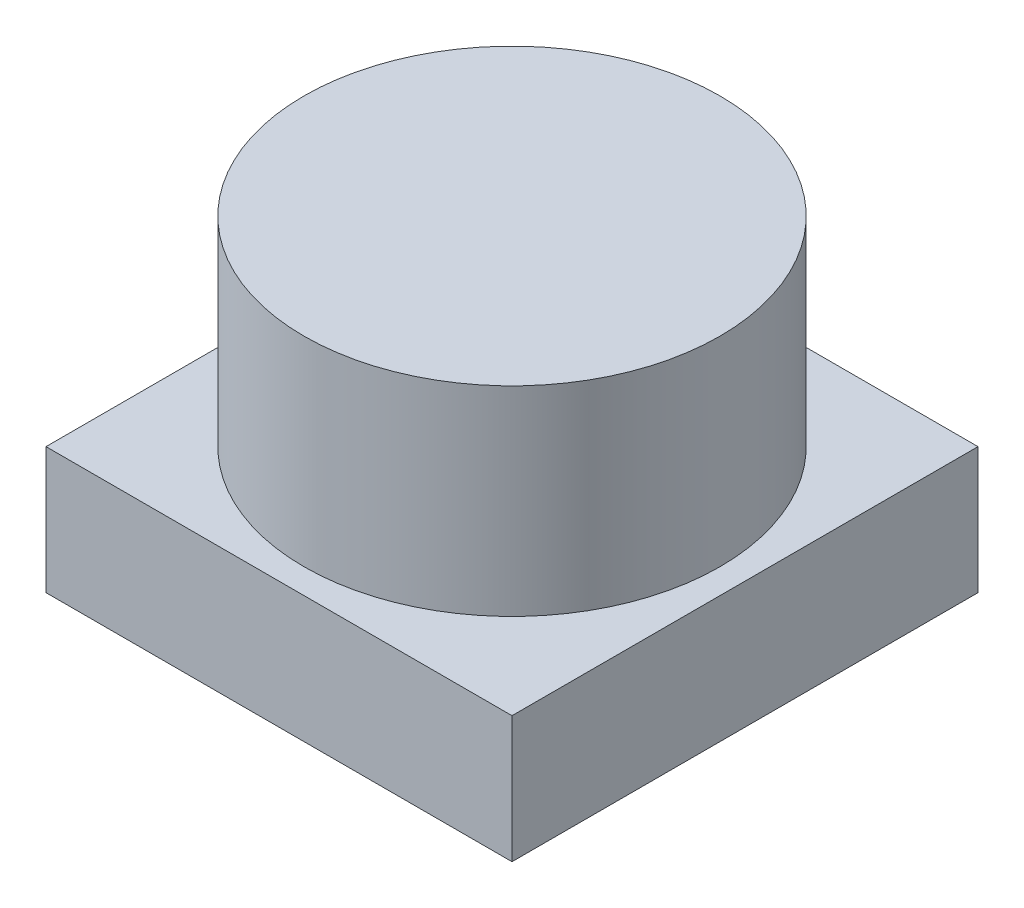
ISO-10303-21;
HEADER;
FILE_DESCRIPTION(('STEP AP214'),'2;1');
FILE_NAME('part.step','',(''),(''),'','','');
FILE_SCHEMA(('AUTOMOTIVE_DESIGN { 1 0 10303 214 1 1 1 1 }'));
ENDSEC;
DATA;
#1=APPLICATION_CONTEXT('core data for automotive mechanical design processes');
#2=APPLICATION_PROTOCOL_DEFINITION('international standard','automotive_design',2000,#1);
#3=PRODUCT_CONTEXT('',#1,'mechanical');
#4=PRODUCT('Part','Part','',(#3));
#5=PRODUCT_RELATED_PRODUCT_CATEGORY('part','',(#4));
#6=PRODUCT_DEFINITION_FORMATION('','',#4);
#7=PRODUCT_DEFINITION_CONTEXT('part definition',#1,'design');
#8=PRODUCT_DEFINITION('design','',#6,#7);
#9=PRODUCT_DEFINITION_SHAPE('','',#8);
#10=(LENGTH_UNIT() NAMED_UNIT(*) SI_UNIT(.MILLI.,.METRE.));
#11=(NAMED_UNIT(*) PLANE_ANGLE_UNIT() SI_UNIT($,.RADIAN.));
#12=(NAMED_UNIT(*) SI_UNIT($,.STERADIAN.) SOLID_ANGLE_UNIT());
#13=UNCERTAINTY_MEASURE_WITH_UNIT(LENGTH_MEASURE(1.E-05),#10,'distance_accuracy_value','');
#14=(GEOMETRIC_REPRESENTATION_CONTEXT(3) GLOBAL_UNCERTAINTY_ASSIGNED_CONTEXT((#13)) GLOBAL_UNIT_ASSIGNED_CONTEXT((#10,
#11,#12)) REPRESENTATION_CONTEXT('',''));
#15=CARTESIAN_POINT('',(0.,0.,0.));
#16=DIRECTION('',(0.,0.,1.));
#17=DIRECTION('',(1.,0.,0.));
#18=AXIS2_PLACEMENT_3D('',#15,#16,#17);
#19=CARTESIAN_POINT('',(-3.5,1.9,-3.5));
#20=DIRECTION('',(1.,0.,0.));
#21=DIRECTION('',(0.,0.,-1.));
#22=AXIS2_PLACEMENT_3D('',#19,#20,#21);
#23=PLANE('',#22);
#24=DIRECTION('',(0.,0.,1.));
#25=VECTOR('',#24,1.);
#26=CARTESIAN_POINT('',(-3.5,0.,-3.5));
#27=LINE('',#26,#25);
#28=CARTESIAN_POINT('',(-3.5,0.,-3.5));
#29=VERTEX_POINT('',#28);
#30=CARTESIAN_POINT('',(-3.5,0.,3.5));
#31=VERTEX_POINT('',#30);
#32=EDGE_CURVE('E110',#29,#31,#27,.T.);
#33=ORIENTED_EDGE('',*,*,#32,.T.);
#34=DIRECTION('',(0.,-1.,0.));
#35=VECTOR('',#34,1.);
#36=CARTESIAN_POINT('',(-3.5,1.9,3.5));
#37=LINE('',#36,#35);
#38=CARTESIAN_POINT('',(-3.5,1.9,3.5));
#39=VERTEX_POINT('',#38);
#40=EDGE_CURVE('E47',#39,#31,#37,.T.);
#41=ORIENTED_EDGE('',*,*,#40,.F.);
#42=DIRECTION('',(0.,0.,1.));
#43=VECTOR('',#42,1.);
#44=CARTESIAN_POINT('',(-3.5,1.9,-3.5));
#45=LINE('',#44,#43);
#46=CARTESIAN_POINT('',(-3.5,1.9,-3.5));
#47=VERTEX_POINT('',#46);
#48=EDGE_CURVE('E97',#47,#39,#45,.T.);
#49=ORIENTED_EDGE('',*,*,#48,.F.);
#50=DIRECTION('',(0.,-1.,0.));
#51=VECTOR('',#50,1.);
#52=CARTESIAN_POINT('',(-3.5,1.9,-3.5));
#53=LINE('',#52,#51);
#54=EDGE_CURVE('E106',#47,#29,#53,.T.);
#55=ORIENTED_EDGE('',*,*,#54,.T.);
#56=EDGE_LOOP('',(#33,#41,#49,#55));
#57=FACE_BOUND('',#56,.T.);
#58=ADVANCED_FACE('F44',(#57),#23,.F.);
#59=CARTESIAN_POINT('',(3.5,1.9,3.5));
#60=DIRECTION('',(0.,0.,-1.));
#61=DIRECTION('',(-1.,0.,0.));
#62=AXIS2_PLACEMENT_3D('',#59,#60,#61);
#63=PLANE('',#62);
#64=DIRECTION('',(1.,0.,0.));
#65=VECTOR('',#64,1.);
#66=CARTESIAN_POINT('',(3.5,0.,3.5));
#67=LINE('',#66,#65);
#68=CARTESIAN_POINT('',(3.5,0.,3.5));
#69=VERTEX_POINT('',#68);
#70=EDGE_CURVE('E102',#31,#69,#67,.T.);
#71=ORIENTED_EDGE('',*,*,#70,.T.);
#72=DIRECTION('',(0.,-1.,0.));
#73=VECTOR('',#72,1.);
#74=CARTESIAN_POINT('',(3.5,1.9,3.5));
#75=LINE('',#74,#73);
#76=CARTESIAN_POINT('',(3.5,1.9,3.5));
#77=VERTEX_POINT('',#76);
#78=EDGE_CURVE('E100',#77,#69,#75,.T.);
#79=ORIENTED_EDGE('',*,*,#78,.F.);
#80=DIRECTION('',(1.,0.,0.));
#81=VECTOR('',#80,1.);
#82=CARTESIAN_POINT('',(3.5,1.9,3.5));
#83=LINE('',#82,#81);
#84=EDGE_CURVE('E92',#39,#77,#83,.T.);
#85=ORIENTED_EDGE('',*,*,#84,.F.);
#86=ORIENTED_EDGE('',*,*,#40,.T.);
#87=EDGE_LOOP('',(#71,#79,#85,#86));
#88=FACE_BOUND('',#87,.T.);
#89=ADVANCED_FACE('F101',(#88),#63,.F.);
#90=CARTESIAN_POINT('',(3.5,1.9,-3.5));
#91=DIRECTION('',(-1.,0.,0.));
#92=DIRECTION('',(0.,0.,1.));
#93=AXIS2_PLACEMENT_3D('',#90,#91,#92);
#94=PLANE('',#93);
#95=DIRECTION('',(0.,0.,-1.));
#96=VECTOR('',#95,1.);
#97=CARTESIAN_POINT('',(3.5,0.,-3.5));
#98=LINE('',#97,#96);
#99=CARTESIAN_POINT('',(3.5,0.,-3.5));
#100=VERTEX_POINT('',#99);
#101=EDGE_CURVE('E78',#69,#100,#98,.T.);
#102=ORIENTED_EDGE('',*,*,#101,.T.);
#103=DIRECTION('',(0.,-1.,0.));
#104=VECTOR('',#103,1.);
#105=CARTESIAN_POINT('',(3.5,1.9,-3.5));
#106=LINE('',#105,#104);
#107=CARTESIAN_POINT('',(3.5,1.9,-3.5));
#108=VERTEX_POINT('',#107);
#109=EDGE_CURVE('E103',#108,#100,#106,.T.);
#110=ORIENTED_EDGE('',*,*,#109,.F.);
#111=DIRECTION('',(0.,0.,-1.));
#112=VECTOR('',#111,1.);
#113=CARTESIAN_POINT('',(3.5,1.9,-3.5));
#114=LINE('',#113,#112);
#115=EDGE_CURVE('E95',#77,#108,#114,.T.);
#116=ORIENTED_EDGE('',*,*,#115,.F.);
#117=ORIENTED_EDGE('',*,*,#78,.T.);
#118=EDGE_LOOP('',(#102,#110,#116,#117));
#119=FACE_BOUND('',#118,.T.);
#120=ADVANCED_FACE('F104',(#119),#94,.F.);
#121=CARTESIAN_POINT('',(3.5,1.9,-3.5));
#122=DIRECTION('',(0.,0.,1.));
#123=DIRECTION('',(1.,0.,0.));
#124=AXIS2_PLACEMENT_3D('',#121,#122,#123);
#125=PLANE('',#124);
#126=DIRECTION('',(-1.,0.,0.));
#127=VECTOR('',#126,1.);
#128=CARTESIAN_POINT('',(3.5,0.,-3.5));
#129=LINE('',#128,#127);
#130=EDGE_CURVE('E84',#100,#29,#129,.T.);
#131=ORIENTED_EDGE('',*,*,#130,.T.);
#132=ORIENTED_EDGE('',*,*,#54,.F.);
#133=DIRECTION('',(-1.,0.,0.));
#134=VECTOR('',#133,1.);
#135=CARTESIAN_POINT('',(3.5,1.9,-3.5));
#136=LINE('',#135,#134);
#137=EDGE_CURVE('E61',#108,#47,#136,.T.);
#138=ORIENTED_EDGE('',*,*,#137,.F.);
#139=ORIENTED_EDGE('',*,*,#109,.T.);
#140=EDGE_LOOP('',(#131,#132,#138,#139));
#141=FACE_BOUND('',#140,.T.);
#142=ADVANCED_FACE('F118',(#141),#125,.F.);
#143=CARTESIAN_POINT('',(0.,1.9,0.));
#144=DIRECTION('',(0.,-1.,0.));
#145=DIRECTION('',(0.,0.,-1.));
#146=AXIS2_PLACEMENT_3D('',#143,#144,#145);
#147=PLANE('',#146);
#148=CARTESIAN_POINT('',(0.,1.9,0.));
#149=DIRECTION('',(0.,1.,0.));
#150=DIRECTION('',(0.,0.,1.));
#151=AXIS2_PLACEMENT_3D('',#148,#149,#150);
#152=CIRCLE('',#151,3.125);
#153=CARTESIAN_POINT('',(0.,1.9,3.125));
#154=VERTEX_POINT('',#153);
#155=EDGE_CURVE('E13',#154,#154,#152,.T.);
#156=ORIENTED_EDGE('',*,*,#155,.F.);
#157=EDGE_LOOP('',(#156));
#158=FACE_BOUND('',#157,.T.);
#159=ORIENTED_EDGE('',*,*,#48,.T.);
#160=ORIENTED_EDGE('',*,*,#84,.T.);
#161=ORIENTED_EDGE('',*,*,#115,.T.);
#162=ORIENTED_EDGE('',*,*,#137,.T.);
#163=EDGE_LOOP('',(#159,#160,#161,#162));
#164=FACE_BOUND('',#163,.T.);
#165=ADVANCED_FACE('F93',(#158,#164),#147,.F.);
#166=CARTESIAN_POINT('',(0.,0.,0.));
#167=DIRECTION('',(0.,-1.,0.));
#168=DIRECTION('',(0.,0.,-1.));
#169=AXIS2_PLACEMENT_3D('',#166,#167,#168);
#170=PLANE('',#169);
#171=ORIENTED_EDGE('',*,*,#32,.F.);
#172=ORIENTED_EDGE('',*,*,#130,.F.);
#173=ORIENTED_EDGE('',*,*,#101,.F.);
#174=ORIENTED_EDGE('',*,*,#70,.F.);
#175=EDGE_LOOP('',(#171,#172,#173,#174));
#176=FACE_BOUND('',#175,.T.);
#177=ADVANCED_FACE('F121',(#176),#170,.T.);
#178=CARTESIAN_POINT('',(0.,4.9,0.));
#179=DIRECTION('',(0.,-1.,0.));
#180=DIRECTION('',(0.,0.,-1.));
#181=AXIS2_PLACEMENT_3D('',#178,#179,#180);
#182=CYLINDRICAL_SURFACE('',#181,3.125);
#183=CARTESIAN_POINT('',(0.,4.9,0.));
#184=DIRECTION('',(0.,1.,0.));
#185=DIRECTION('',(0.,0.,1.));
#186=AXIS2_PLACEMENT_3D('',#183,#184,#185);
#187=CIRCLE('',#186,3.125);
#188=CARTESIAN_POINT('',(0.,4.9,3.125));
#189=VERTEX_POINT('',#188);
#190=EDGE_CURVE('E113',#189,#189,#187,.T.);
#191=ORIENTED_EDGE('',*,*,#190,.F.);
#192=EDGE_LOOP('',(#191));
#193=FACE_BOUND('',#192,.T.);
#194=ORIENTED_EDGE('',*,*,#155,.T.);
#195=EDGE_LOOP('',(#194));
#196=FACE_BOUND('',#195,.T.);
#197=ADVANCED_FACE('F129',(#193,#196),#182,.T.);
#198=CARTESIAN_POINT('',(0.,4.9,0.));
#199=DIRECTION('',(0.,1.,0.));
#200=DIRECTION('',(0.,0.,1.));
#201=AXIS2_PLACEMENT_3D('',#198,#199,#200);
#202=PLANE('',#201);
#203=ORIENTED_EDGE('',*,*,#190,.T.);
#204=EDGE_LOOP('',(#203));
#205=FACE_BOUND('',#204,.T.);
#206=ADVANCED_FACE('F127',(#205),#202,.T.);
#207=CLOSED_SHELL('',(#58,#89,#120,#142,#165,#177,#197,#206));
#208=MANIFOLD_SOLID_BREP('B2',#207);
#209=ADVANCED_BREP_SHAPE_REPRESENTATION('',(#18,#208),#14);
#210=SHAPE_DEFINITION_REPRESENTATION(#9,#209);
ENDSEC;
END-ISO-10303-21;
